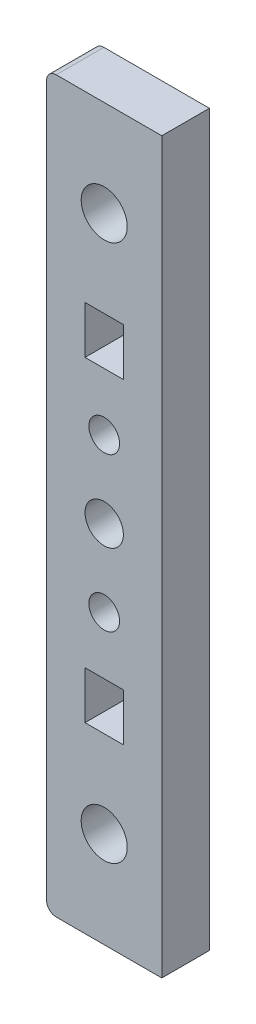
ISO-10303-21;
HEADER;
FILE_DESCRIPTION(('STEP AP214'),'2;1');
FILE_NAME('part.step','',(''),(''),'','','');
FILE_SCHEMA(('AUTOMOTIVE_DESIGN { 1 0 10303 214 1 1 1 1 }'));
ENDSEC;
DATA;
#1=APPLICATION_CONTEXT('core data for automotive mechanical design processes');
#2=APPLICATION_PROTOCOL_DEFINITION('international standard','automotive_design',2000,#1);
#3=PRODUCT_CONTEXT('',#1,'mechanical');
#4=PRODUCT('Part','Part','',(#3));
#5=PRODUCT_RELATED_PRODUCT_CATEGORY('part','',(#4));
#6=PRODUCT_DEFINITION_FORMATION('','',#4);
#7=PRODUCT_DEFINITION_CONTEXT('part definition',#1,'design');
#8=PRODUCT_DEFINITION('design','',#6,#7);
#9=PRODUCT_DEFINITION_SHAPE('','',#8);
#10=(LENGTH_UNIT() NAMED_UNIT(*) SI_UNIT(.MILLI.,.METRE.));
#11=(NAMED_UNIT(*) PLANE_ANGLE_UNIT() SI_UNIT($,.RADIAN.));
#12=(NAMED_UNIT(*) SI_UNIT($,.STERADIAN.) SOLID_ANGLE_UNIT());
#13=UNCERTAINTY_MEASURE_WITH_UNIT(LENGTH_MEASURE(1.E-05),#10,'distance_accuracy_value','');
#14=(GEOMETRIC_REPRESENTATION_CONTEXT(3) GLOBAL_UNCERTAINTY_ASSIGNED_CONTEXT((#13)) GLOBAL_UNIT_ASSIGNED_CONTEXT((#10,
#11,#12)) REPRESENTATION_CONTEXT('',''));
#15=CARTESIAN_POINT('',(0.,0.,0.));
#16=DIRECTION('',(0.,0.,1.));
#17=DIRECTION('',(1.,0.,0.));
#18=AXIS2_PLACEMENT_3D('',#15,#16,#17);
#19=CARTESIAN_POINT('',(-27.5,187.5,12.4));
#20=DIRECTION('',(0.,0.,1.));
#21=DIRECTION('',(1.,0.,0.));
#22=AXIS2_PLACEMENT_3D('',#19,#20,#21);
#23=PLANE('',#22);
#24=CARTESIAN_POINT('',(-15.,115.,12.4));
#25=DIRECTION('',(0.,0.,1.));
#26=DIRECTION('',(1.,0.,0.));
#27=AXIS2_PLACEMENT_3D('',#24,#25,#26);
#28=CIRCLE('',#27,4.00000000000001);
#29=CARTESIAN_POINT('',(-19.,115.,12.4));
#30=VERTEX_POINT('',#29);
#31=EDGE_CURVE('E163',#30,#30,#28,.T.);
#32=ORIENTED_EDGE('',*,*,#31,.F.);
#33=EDGE_LOOP('',(#32));
#34=FACE_BOUND('',#33,.T.);
#35=DIRECTION('',(-1.,0.,0.));
#36=VECTOR('',#35,1.);
#37=CARTESIAN_POINT('',(-20.,142.4,12.4));
#38=LINE('',#37,#36);
#39=CARTESIAN_POINT('',(-10.,142.4,12.4));
#40=VERTEX_POINT('',#39);
#41=CARTESIAN_POINT('',(-20.,142.4,12.4));
#42=VERTEX_POINT('',#41);
#43=EDGE_CURVE('E181',#40,#42,#38,.T.);
#44=ORIENTED_EDGE('',*,*,#43,.F.);
#45=DIRECTION('',(0.,1.,0.));
#46=VECTOR('',#45,1.);
#47=CARTESIAN_POINT('',(-10.,142.4,12.4));
#48=LINE('',#47,#46);
#49=CARTESIAN_POINT('',(-10.,130.,12.4));
#50=VERTEX_POINT('',#49);
#51=EDGE_CURVE('E179',#50,#40,#48,.T.);
#52=ORIENTED_EDGE('',*,*,#51,.F.);
#53=DIRECTION('',(1.,0.,0.));
#54=VECTOR('',#53,1.);
#55=CARTESIAN_POINT('',(-20.,130.,12.4));
#56=LINE('',#55,#54);
#57=CARTESIAN_POINT('',(-20.,130.,12.4));
#58=VERTEX_POINT('',#57);
#59=EDGE_CURVE('E187',#58,#50,#56,.T.);
#60=ORIENTED_EDGE('',*,*,#59,.F.);
#61=DIRECTION('',(0.,-1.,0.));
#62=VECTOR('',#61,1.);
#63=CARTESIAN_POINT('',(-20.,142.4,12.4));
#64=LINE('',#63,#62);
#65=EDGE_CURVE('E184',#42,#58,#64,.T.);
#66=ORIENTED_EDGE('',*,*,#65,.F.);
#67=EDGE_LOOP('',(#44,#52,#60,#66));
#68=FACE_BOUND('',#67,.T.);
#69=CARTESIAN_POINT('',(-15.,95.,12.4));
#70=DIRECTION('',(0.,0.,1.));
#71=DIRECTION('',(1.,0.,0.));
#72=AXIS2_PLACEMENT_3D('',#69,#70,#71);
#73=CIRCLE('',#72,5.);
#74=CARTESIAN_POINT('',(-20.,95.,12.4));
#75=VERTEX_POINT('',#74);
#76=EDGE_CURVE('E210',#75,#75,#73,.T.);
#77=ORIENTED_EDGE('',*,*,#76,.F.);
#78=EDGE_LOOP('',(#77));
#79=FACE_BOUND('',#78,.T.);
#80=DIRECTION('',(0.,1.,0.));
#81=VECTOR('',#80,1.);
#82=CARTESIAN_POINT('',(0.,0.,12.4));
#83=LINE('',#82,#81);
#84=CARTESIAN_POINT('',(0.,0.,12.4));
#85=VERTEX_POINT('',#84);
#86=CARTESIAN_POINT('',(0.,190.,12.4));
#87=VERTEX_POINT('',#86);
#88=EDGE_CURVE('E222',#85,#87,#83,.T.);
#89=ORIENTED_EDGE('',*,*,#88,.T.);
#90=DIRECTION('',(-1.,0.,0.));
#91=VECTOR('',#90,1.);
#92=CARTESIAN_POINT('',(-27.5,190.,12.4));
#93=LINE('',#92,#91);
#94=CARTESIAN_POINT('',(-27.5,190.,12.4));
#95=VERTEX_POINT('',#94);
#96=EDGE_CURVE('E225',#87,#95,#93,.T.);
#97=ORIENTED_EDGE('',*,*,#96,.T.);
#98=CARTESIAN_POINT('',(-27.5,187.5,12.4));
#99=DIRECTION('',(0.,0.,1.));
#100=DIRECTION('',(1.,0.,0.));
#101=AXIS2_PLACEMENT_3D('',#98,#99,#100);
#102=CIRCLE('',#101,2.5);
#103=CARTESIAN_POINT('',(-30.,187.5,12.4));
#104=VERTEX_POINT('',#103);
#105=EDGE_CURVE('E228',#95,#104,#102,.T.);
#106=ORIENTED_EDGE('',*,*,#105,.T.);
#107=DIRECTION('',(0.,-1.,0.));
#108=VECTOR('',#107,1.);
#109=CARTESIAN_POINT('',(-30.,2.5,12.4));
#110=LINE('',#109,#108);
#111=CARTESIAN_POINT('',(-30.,2.5,12.4));
#112=VERTEX_POINT('',#111);
#113=EDGE_CURVE('E230',#104,#112,#110,.T.);
#114=ORIENTED_EDGE('',*,*,#113,.T.);
#115=CARTESIAN_POINT('',(-27.5,2.5,12.4));
#116=DIRECTION('',(0.,0.,1.));
#117=DIRECTION('',(1.,0.,0.));
#118=AXIS2_PLACEMENT_3D('',#115,#116,#117);
#119=CIRCLE('',#118,2.5);
#120=CARTESIAN_POINT('',(-27.5,0.,12.4));
#121=VERTEX_POINT('',#120);
#122=EDGE_CURVE('E232',#112,#121,#119,.T.);
#123=ORIENTED_EDGE('',*,*,#122,.T.);
#124=DIRECTION('',(1.,0.,0.));
#125=VECTOR('',#124,1.);
#126=CARTESIAN_POINT('',(-27.5,0.,12.4));
#127=LINE('',#126,#125);
#128=EDGE_CURVE('E234',#121,#85,#127,.T.);
#129=ORIENTED_EDGE('',*,*,#128,.T.);
#130=EDGE_LOOP('',(#89,#97,#106,#114,#123,#129));
#131=FACE_BOUND('',#130,.T.);
#132=CARTESIAN_POINT('',(-15.,165.,12.4));
#133=DIRECTION('',(0.,0.,1.));
#134=DIRECTION('',(1.,0.,0.));
#135=AXIS2_PLACEMENT_3D('',#132,#133,#134);
#136=CIRCLE('',#135,6.);
#137=CARTESIAN_POINT('',(-21.,165.,12.4));
#138=VERTEX_POINT('',#137);
#139=EDGE_CURVE('E216',#138,#138,#136,.T.);
#140=ORIENTED_EDGE('',*,*,#139,.F.);
#141=EDGE_LOOP('',(#140));
#142=FACE_BOUND('',#141,.T.);
#143=CARTESIAN_POINT('',(-15.,25.,12.4));
#144=DIRECTION('',(0.,0.,1.));
#145=DIRECTION('',(-1.,0.,0.));
#146=AXIS2_PLACEMENT_3D('',#143,#144,#145);
#147=CIRCLE('',#146,6.);
#148=CARTESIAN_POINT('',(-21.,25.,12.4));
#149=VERTEX_POINT('',#148);
#150=EDGE_CURVE('E173',#149,#149,#147,.T.);
#151=ORIENTED_EDGE('',*,*,#150,.F.);
#152=EDGE_LOOP('',(#151));
#153=FACE_BOUND('',#152,.T.);
#154=DIRECTION('',(1.,0.,0.));
#155=VECTOR('',#154,1.);
#156=CARTESIAN_POINT('',(-20.,47.6,12.4));
#157=LINE('',#156,#155);
#158=CARTESIAN_POINT('',(-20.,47.6,12.4));
#159=VERTEX_POINT('',#158);
#160=CARTESIAN_POINT('',(-10.,47.6,12.4));
#161=VERTEX_POINT('',#160);
#162=EDGE_CURVE('E142',#159,#161,#157,.T.);
#163=ORIENTED_EDGE('',*,*,#162,.F.);
#164=DIRECTION('',(0.,-1.,0.));
#165=VECTOR('',#164,1.);
#166=CARTESIAN_POINT('',(-20.,47.6,12.4));
#167=LINE('',#166,#165);
#168=CARTESIAN_POINT('',(-20.,60.,12.4));
#169=VERTEX_POINT('',#168);
#170=EDGE_CURVE('E134',#169,#159,#167,.T.);
#171=ORIENTED_EDGE('',*,*,#170,.F.);
#172=DIRECTION('',(-1.,0.,0.));
#173=VECTOR('',#172,1.);
#174=CARTESIAN_POINT('',(-20.,60.,12.4));
#175=LINE('',#174,#173);
#176=CARTESIAN_POINT('',(-10.,60.,12.4));
#177=VERTEX_POINT('',#176);
#178=EDGE_CURVE('E157',#177,#169,#175,.T.);
#179=ORIENTED_EDGE('',*,*,#178,.F.);
#180=DIRECTION('',(0.,1.,0.));
#181=VECTOR('',#180,1.);
#182=CARTESIAN_POINT('',(-10.,47.6,12.4));
#183=LINE('',#182,#181);
#184=EDGE_CURVE('E155',#161,#177,#183,.T.);
#185=ORIENTED_EDGE('',*,*,#184,.F.);
#186=EDGE_LOOP('',(#163,#171,#179,#185));
#187=FACE_BOUND('',#186,.T.);
#188=CARTESIAN_POINT('',(-15.,75.,12.4));
#189=DIRECTION('',(0.,0.,1.));
#190=DIRECTION('',(-1.,0.,0.));
#191=AXIS2_PLACEMENT_3D('',#188,#189,#190);
#192=CIRCLE('',#191,4.00000000000001);
#193=CARTESIAN_POINT('',(-19.,75.,12.4));
#194=VERTEX_POINT('',#193);
#195=EDGE_CURVE('E359',#194,#194,#192,.T.);
#196=ORIENTED_EDGE('',*,*,#195,.F.);
#197=EDGE_LOOP('',(#196));
#198=FACE_BOUND('',#197,.T.);
#199=ADVANCED_FACE('F33',(#34,#68,#79,#131,#142,#153,#187,#198),#23,.T.);
#200=CARTESIAN_POINT('',(-27.5,187.5,0.));
#201=DIRECTION('',(0.,0.,1.));
#202=DIRECTION('',(1.,0.,0.));
#203=AXIS2_PLACEMENT_3D('',#200,#201,#202);
#204=PLANE('',#203);
#205=CARTESIAN_POINT('',(-15.,25.,0.));
#206=DIRECTION('',(0.,0.,1.));
#207=DIRECTION('',(-1.,0.,0.));
#208=AXIS2_PLACEMENT_3D('',#205,#206,#207);
#209=CIRCLE('',#208,6.);
#210=CARTESIAN_POINT('',(-21.,25.,0.));
#211=VERTEX_POINT('',#210);
#212=EDGE_CURVE('E150',#211,#211,#209,.T.);
#213=ORIENTED_EDGE('',*,*,#212,.T.);
#214=EDGE_LOOP('',(#213));
#215=FACE_BOUND('',#214,.T.);
#216=DIRECTION('',(0.,1.,0.));
#217=VECTOR('',#216,1.);
#218=CARTESIAN_POINT('',(-10.,142.4,0.));
#219=LINE('',#218,#217);
#220=CARTESIAN_POINT('',(-10.,130.,0.));
#221=VERTEX_POINT('',#220);
#222=CARTESIAN_POINT('',(-10.,142.4,0.));
#223=VERTEX_POINT('',#222);
#224=EDGE_CURVE('E176',#221,#223,#219,.T.);
#225=ORIENTED_EDGE('',*,*,#224,.T.);
#226=DIRECTION('',(-1.,0.,0.));
#227=VECTOR('',#226,1.);
#228=CARTESIAN_POINT('',(-20.,142.4,0.));
#229=LINE('',#228,#227);
#230=CARTESIAN_POINT('',(-20.,142.4,0.));
#231=VERTEX_POINT('',#230);
#232=EDGE_CURVE('E192',#223,#231,#229,.T.);
#233=ORIENTED_EDGE('',*,*,#232,.T.);
#234=DIRECTION('',(0.,-1.,0.));
#235=VECTOR('',#234,1.);
#236=CARTESIAN_POINT('',(-20.,142.4,0.));
#237=LINE('',#236,#235);
#238=CARTESIAN_POINT('',(-20.,130.,0.));
#239=VERTEX_POINT('',#238);
#240=EDGE_CURVE('E195',#231,#239,#237,.T.);
#241=ORIENTED_EDGE('',*,*,#240,.T.);
#242=DIRECTION('',(1.,0.,0.));
#243=VECTOR('',#242,1.);
#244=CARTESIAN_POINT('',(-20.,130.,0.));
#245=LINE('',#244,#243);
#246=EDGE_CURVE('E182',#239,#221,#245,.T.);
#247=ORIENTED_EDGE('',*,*,#246,.T.);
#248=EDGE_LOOP('',(#225,#233,#241,#247));
#249=FACE_BOUND('',#248,.T.);
#250=DIRECTION('',(0.,1.,0.));
#251=VECTOR('',#250,1.);
#252=CARTESIAN_POINT('',(0.,0.,0.));
#253=LINE('',#252,#251);
#254=CARTESIAN_POINT('',(0.,0.,0.));
#255=VERTEX_POINT('',#254);
#256=CARTESIAN_POINT('',(0.,190.,0.));
#257=VERTEX_POINT('',#256);
#258=EDGE_CURVE('E219',#255,#257,#253,.T.);
#259=ORIENTED_EDGE('',*,*,#258,.F.);
#260=DIRECTION('',(1.,0.,0.));
#261=VECTOR('',#260,1.);
#262=CARTESIAN_POINT('',(-27.5,0.,0.));
#263=LINE('',#262,#261);
#264=CARTESIAN_POINT('',(-27.5,0.,0.));
#265=VERTEX_POINT('',#264);
#266=EDGE_CURVE('E226',#265,#255,#263,.T.);
#267=ORIENTED_EDGE('',*,*,#266,.F.);
#268=CARTESIAN_POINT('',(-27.5,2.5,0.));
#269=DIRECTION('',(0.,0.,1.));
#270=DIRECTION('',(1.,0.,0.));
#271=AXIS2_PLACEMENT_3D('',#268,#269,#270);
#272=CIRCLE('',#271,2.5);
#273=CARTESIAN_POINT('',(-30.,2.5,0.));
#274=VERTEX_POINT('',#273);
#275=EDGE_CURVE('E245',#274,#265,#272,.T.);
#276=ORIENTED_EDGE('',*,*,#275,.F.);
#277=DIRECTION('',(0.,-1.,0.));
#278=VECTOR('',#277,1.);
#279=CARTESIAN_POINT('',(-30.,2.5,0.));
#280=LINE('',#279,#278);
#281=CARTESIAN_POINT('',(-30.,187.5,0.));
#282=VERTEX_POINT('',#281);
#283=EDGE_CURVE('E243',#282,#274,#280,.T.);
#284=ORIENTED_EDGE('',*,*,#283,.F.);
#285=CARTESIAN_POINT('',(-27.5,187.5,0.));
#286=DIRECTION('',(0.,0.,1.));
#287=DIRECTION('',(1.,0.,0.));
#288=AXIS2_PLACEMENT_3D('',#285,#286,#287);
#289=CIRCLE('',#288,2.5);
#290=CARTESIAN_POINT('',(-27.5,190.,0.));
#291=VERTEX_POINT('',#290);
#292=EDGE_CURVE('E241',#291,#282,#289,.T.);
#293=ORIENTED_EDGE('',*,*,#292,.F.);
#294=DIRECTION('',(-1.,0.,0.));
#295=VECTOR('',#294,1.);
#296=CARTESIAN_POINT('',(-27.5,190.,0.));
#297=LINE('',#296,#295);
#298=EDGE_CURVE('E239',#257,#291,#297,.T.);
#299=ORIENTED_EDGE('',*,*,#298,.F.);
#300=EDGE_LOOP('',(#259,#267,#276,#284,#293,#299));
#301=FACE_BOUND('',#300,.T.);
#302=CARTESIAN_POINT('',(-15.,165.,0.));
#303=DIRECTION('',(0.,0.,1.));
#304=DIRECTION('',(1.,0.,0.));
#305=AXIS2_PLACEMENT_3D('',#302,#303,#304);
#306=CIRCLE('',#305,6.);
#307=CARTESIAN_POINT('',(-21.,165.,0.));
#308=VERTEX_POINT('',#307);
#309=EDGE_CURVE('E213',#308,#308,#306,.T.);
#310=ORIENTED_EDGE('',*,*,#309,.T.);
#311=EDGE_LOOP('',(#310));
#312=FACE_BOUND('',#311,.T.);
#313=CARTESIAN_POINT('',(-15.,95.,0.));
#314=DIRECTION('',(0.,0.,1.));
#315=DIRECTION('',(1.,0.,0.));
#316=AXIS2_PLACEMENT_3D('',#313,#314,#315);
#317=CIRCLE('',#316,5.);
#318=CARTESIAN_POINT('',(-20.,95.,0.));
#319=VERTEX_POINT('',#318);
#320=EDGE_CURVE('E209',#319,#319,#317,.T.);
#321=ORIENTED_EDGE('',*,*,#320,.T.);
#322=EDGE_LOOP('',(#321));
#323=FACE_BOUND('',#322,.T.);
#324=DIRECTION('',(0.,-1.,0.));
#325=VECTOR('',#324,1.);
#326=CARTESIAN_POINT('',(-20.,47.6,0.));
#327=LINE('',#326,#325);
#328=CARTESIAN_POINT('',(-20.,60.,0.));
#329=VERTEX_POINT('',#328);
#330=CARTESIAN_POINT('',(-20.,47.6,0.));
#331=VERTEX_POINT('',#330);
#332=EDGE_CURVE('E56',#329,#331,#327,.T.);
#333=ORIENTED_EDGE('',*,*,#332,.T.);
#334=DIRECTION('',(1.,0.,0.));
#335=VECTOR('',#334,1.);
#336=CARTESIAN_POINT('',(-20.,47.6,0.));
#337=LINE('',#336,#335);
#338=CARTESIAN_POINT('',(-10.,47.6,0.));
#339=VERTEX_POINT('',#338);
#340=EDGE_CURVE('E149',#331,#339,#337,.T.);
#341=ORIENTED_EDGE('',*,*,#340,.T.);
#342=DIRECTION('',(0.,1.,0.));
#343=VECTOR('',#342,1.);
#344=CARTESIAN_POINT('',(-10.,47.6,0.));
#345=LINE('',#344,#343);
#346=CARTESIAN_POINT('',(-10.,60.,0.));
#347=VERTEX_POINT('',#346);
#348=EDGE_CURVE('E165',#339,#347,#345,.T.);
#349=ORIENTED_EDGE('',*,*,#348,.T.);
#350=DIRECTION('',(-1.,0.,0.));
#351=VECTOR('',#350,1.);
#352=CARTESIAN_POINT('',(-20.,60.,0.));
#353=LINE('',#352,#351);
#354=EDGE_CURVE('E143',#347,#329,#353,.T.);
#355=ORIENTED_EDGE('',*,*,#354,.T.);
#356=EDGE_LOOP('',(#333,#341,#349,#355));
#357=FACE_BOUND('',#356,.T.);
#358=CARTESIAN_POINT('',(-15.,115.,0.));
#359=DIRECTION('',(0.,0.,1.));
#360=DIRECTION('',(1.,0.,0.));
#361=AXIS2_PLACEMENT_3D('',#358,#359,#360);
#362=CIRCLE('',#361,4.00000000000001);
#363=CARTESIAN_POINT('',(-19.,115.,0.));
#364=VERTEX_POINT('',#363);
#365=EDGE_CURVE('E365',#364,#364,#362,.T.);
#366=ORIENTED_EDGE('',*,*,#365,.T.);
#367=EDGE_LOOP('',(#366));
#368=FACE_BOUND('',#367,.T.);
#369=CARTESIAN_POINT('',(-15.,75.,0.));
#370=DIRECTION('',(0.,0.,1.));
#371=DIRECTION('',(-1.,0.,0.));
#372=AXIS2_PLACEMENT_3D('',#369,#370,#371);
#373=CIRCLE('',#372,4.00000000000001);
#374=CARTESIAN_POINT('',(-19.,75.,0.));
#375=VERTEX_POINT('',#374);
#376=EDGE_CURVE('E362',#375,#375,#373,.T.);
#377=ORIENTED_EDGE('',*,*,#376,.T.);
#378=EDGE_LOOP('',(#377));
#379=FACE_BOUND('',#378,.T.);
#380=ADVANCED_FACE('F269',(#215,#249,#301,#312,#323,#357,#368,#379),#204,.F.);
#381=CARTESIAN_POINT('',(0.,0.,12.4));
#382=DIRECTION('',(-1.,0.,0.));
#383=DIRECTION('',(0.,0.,1.));
#384=AXIS2_PLACEMENT_3D('',#381,#382,#383);
#385=PLANE('',#384);
#386=ORIENTED_EDGE('',*,*,#258,.T.);
#387=DIRECTION('',(0.,0.,-1.));
#388=VECTOR('',#387,1.);
#389=CARTESIAN_POINT('',(0.,190.,12.4));
#390=LINE('',#389,#388);
#391=EDGE_CURVE('E11',#87,#257,#390,.T.);
#392=ORIENTED_EDGE('',*,*,#391,.F.);
#393=ORIENTED_EDGE('',*,*,#88,.F.);
#394=DIRECTION('',(0.,0.,-1.));
#395=VECTOR('',#394,1.);
#396=CARTESIAN_POINT('',(0.,0.,12.4));
#397=LINE('',#396,#395);
#398=EDGE_CURVE('E236',#85,#255,#397,.T.);
#399=ORIENTED_EDGE('',*,*,#398,.T.);
#400=EDGE_LOOP('',(#386,#392,#393,#399));
#401=FACE_BOUND('',#400,.T.);
#402=ADVANCED_FACE('F35',(#401),#385,.F.);
#403=CARTESIAN_POINT('',(-27.5,190.,12.4));
#404=DIRECTION('',(0.,-1.,0.));
#405=DIRECTION('',(0.,0.,-1.));
#406=AXIS2_PLACEMENT_3D('',#403,#404,#405);
#407=PLANE('',#406);
#408=ORIENTED_EDGE('',*,*,#298,.T.);
#409=DIRECTION('',(0.,0.,-1.));
#410=VECTOR('',#409,1.);
#411=CARTESIAN_POINT('',(-27.5,190.,12.4));
#412=LINE('',#411,#410);
#413=EDGE_CURVE('E41',#95,#291,#412,.T.);
#414=ORIENTED_EDGE('',*,*,#413,.F.);
#415=ORIENTED_EDGE('',*,*,#96,.F.);
#416=ORIENTED_EDGE('',*,*,#391,.T.);
#417=EDGE_LOOP('',(#408,#414,#415,#416));
#418=FACE_BOUND('',#417,.T.);
#419=ADVANCED_FACE('F287',(#418),#407,.F.);
#420=CARTESIAN_POINT('',(-27.5,187.5,12.4));
#421=DIRECTION('',(0.,0.,-1.));
#422=DIRECTION('',(-1.,0.,0.));
#423=AXIS2_PLACEMENT_3D('',#420,#421,#422);
#424=CYLINDRICAL_SURFACE('',#423,2.5);
#425=ORIENTED_EDGE('',*,*,#292,.T.);
#426=DIRECTION('',(0.,0.,-1.));
#427=VECTOR('',#426,1.);
#428=CARTESIAN_POINT('',(-30.,187.5,12.4));
#429=LINE('',#428,#427);
#430=EDGE_CURVE('E256',#104,#282,#429,.T.);
#431=ORIENTED_EDGE('',*,*,#430,.F.);
#432=ORIENTED_EDGE('',*,*,#105,.F.);
#433=ORIENTED_EDGE('',*,*,#413,.T.);
#434=EDGE_LOOP('',(#425,#431,#432,#433));
#435=FACE_BOUND('',#434,.T.);
#436=ADVANCED_FACE('F263',(#435),#424,.T.);
#437=CARTESIAN_POINT('',(-30.,2.5,12.4));
#438=DIRECTION('',(1.,0.,0.));
#439=DIRECTION('',(0.,0.,-1.));
#440=AXIS2_PLACEMENT_3D('',#437,#438,#439);
#441=PLANE('',#440);
#442=ORIENTED_EDGE('',*,*,#283,.T.);
#443=DIRECTION('',(0.,0.,-1.));
#444=VECTOR('',#443,1.);
#445=CARTESIAN_POINT('',(-30.,2.5,12.4));
#446=LINE('',#445,#444);
#447=EDGE_CURVE('E253',#112,#274,#446,.T.);
#448=ORIENTED_EDGE('',*,*,#447,.F.);
#449=ORIENTED_EDGE('',*,*,#113,.F.);
#450=ORIENTED_EDGE('',*,*,#430,.T.);
#451=EDGE_LOOP('',(#442,#448,#449,#450));
#452=FACE_BOUND('',#451,.T.);
#453=ADVANCED_FACE('F275',(#452),#441,.F.);
#454=CARTESIAN_POINT('',(-27.5,2.5,12.4));
#455=DIRECTION('',(0.,0.,-1.));
#456=DIRECTION('',(-1.,0.,0.));
#457=AXIS2_PLACEMENT_3D('',#454,#455,#456);
#458=CYLINDRICAL_SURFACE('',#457,2.5);
#459=ORIENTED_EDGE('',*,*,#275,.T.);
#460=DIRECTION('',(0.,0.,-1.));
#461=VECTOR('',#460,1.);
#462=CARTESIAN_POINT('',(-27.5,0.,12.4));
#463=LINE('',#462,#461);
#464=EDGE_CURVE('E250',#121,#265,#463,.T.);
#465=ORIENTED_EDGE('',*,*,#464,.F.);
#466=ORIENTED_EDGE('',*,*,#122,.F.);
#467=ORIENTED_EDGE('',*,*,#447,.T.);
#468=EDGE_LOOP('',(#459,#465,#466,#467));
#469=FACE_BOUND('',#468,.T.);
#470=ADVANCED_FACE('F279',(#469),#458,.T.);
#471=CARTESIAN_POINT('',(-27.5,0.,12.4));
#472=DIRECTION('',(0.,1.,0.));
#473=DIRECTION('',(0.,0.,1.));
#474=AXIS2_PLACEMENT_3D('',#471,#472,#473);
#475=PLANE('',#474);
#476=ORIENTED_EDGE('',*,*,#266,.T.);
#477=ORIENTED_EDGE('',*,*,#398,.F.);
#478=ORIENTED_EDGE('',*,*,#128,.F.);
#479=ORIENTED_EDGE('',*,*,#464,.T.);
#480=EDGE_LOOP('',(#476,#477,#478,#479));
#481=FACE_BOUND('',#480,.T.);
#482=ADVANCED_FACE('F290',(#481),#475,.F.);
#483=CARTESIAN_POINT('',(-15.,165.,12.4));
#484=DIRECTION('',(0.,0.,-1.));
#485=DIRECTION('',(-1.,0.,0.));
#486=AXIS2_PLACEMENT_3D('',#483,#484,#485);
#487=CYLINDRICAL_SURFACE('',#486,6.);
#488=CARTESIAN_POINT('',(-21.,165.,12.4));
#489=CARTESIAN_POINT('',(-21.,165.,12.2708333333333));
#490=CARTESIAN_POINT('',(-21.,165.,12.1416666666667));
#491=CARTESIAN_POINT('',(-21.,165.,11.8833333333333));
#492=CARTESIAN_POINT('',(-21.,165.,11.7541666666667));
#493=CARTESIAN_POINT('',(-21.,165.,11.4958333333333));
#494=CARTESIAN_POINT('',(-21.,165.,11.3666666666667));
#495=CARTESIAN_POINT('',(-21.,165.,11.1083333333333));
#496=CARTESIAN_POINT('',(-21.,165.,10.9791666666667));
#497=CARTESIAN_POINT('',(-21.,165.,10.7208333333333));
#498=CARTESIAN_POINT('',(-21.,165.,10.5916666666667));
#499=CARTESIAN_POINT('',(-21.,165.,10.3333333333333));
#500=CARTESIAN_POINT('',(-21.,165.,10.2041666666667));
#501=CARTESIAN_POINT('',(-21.,165.,9.94583333333333));
#502=CARTESIAN_POINT('',(-21.,165.,9.81666666666666));
#503=CARTESIAN_POINT('',(-21.,165.,9.55833333333333));
#504=CARTESIAN_POINT('',(-21.,165.,9.42916666666667));
#505=CARTESIAN_POINT('',(-21.,165.,9.17083333333333));
#506=CARTESIAN_POINT('',(-21.,165.,9.04166666666667));
#507=CARTESIAN_POINT('',(-21.,165.,8.78333333333333));
#508=CARTESIAN_POINT('',(-21.,165.,8.65416666666667));
#509=CARTESIAN_POINT('',(-21.,165.,8.39583333333333));
#510=CARTESIAN_POINT('',(-21.,165.,8.26666666666667));
#511=CARTESIAN_POINT('',(-21.,165.,8.00833333333333));
#512=CARTESIAN_POINT('',(-21.,165.,7.87916666666667));
#513=CARTESIAN_POINT('',(-21.,165.,7.62083333333333));
#514=CARTESIAN_POINT('',(-21.,165.,7.49166666666667));
#515=CARTESIAN_POINT('',(-21.,165.,7.23333333333333));
#516=CARTESIAN_POINT('',(-21.,165.,7.10416666666667));
#517=CARTESIAN_POINT('',(-21.,165.,6.84583333333333));
#518=CARTESIAN_POINT('',(-21.,165.,6.71666666666667));
#519=CARTESIAN_POINT('',(-21.,165.,6.45833333333333));
#520=CARTESIAN_POINT('',(-21.,165.,6.32916666666667));
#521=CARTESIAN_POINT('',(-21.,165.,6.07083333333333));
#522=CARTESIAN_POINT('',(-21.,165.,5.94166666666667));
#523=CARTESIAN_POINT('',(-21.,165.,5.68333333333333));
#524=CARTESIAN_POINT('',(-21.,165.,5.55416666666667));
#525=CARTESIAN_POINT('',(-21.,165.,5.29583333333333));
#526=CARTESIAN_POINT('',(-21.,165.,5.16666666666667));
#527=CARTESIAN_POINT('',(-21.,165.,4.90833333333333));
#528=CARTESIAN_POINT('',(-21.,165.,4.77916666666667));
#529=CARTESIAN_POINT('',(-21.,165.,4.52083333333333));
#530=CARTESIAN_POINT('',(-21.,165.,4.39166666666667));
#531=CARTESIAN_POINT('',(-21.,165.,4.13333333333333));
#532=CARTESIAN_POINT('',(-21.,165.,4.00416666666667));
#533=CARTESIAN_POINT('',(-21.,165.,3.74583333333333));
#534=CARTESIAN_POINT('',(-21.,165.,3.61666666666667));
#535=CARTESIAN_POINT('',(-21.,165.,3.35833333333333));
#536=CARTESIAN_POINT('',(-21.,165.,3.22916666666667));
#537=CARTESIAN_POINT('',(-21.,165.,2.97083333333333));
#538=CARTESIAN_POINT('',(-21.,165.,2.84166666666667));
#539=CARTESIAN_POINT('',(-21.,165.,2.58333333333333));
#540=CARTESIAN_POINT('',(-21.,165.,2.45416666666667));
#541=CARTESIAN_POINT('',(-21.,165.,2.19583333333333));
#542=CARTESIAN_POINT('',(-21.,165.,2.06666666666667));
#543=CARTESIAN_POINT('',(-21.,165.,1.80833333333333));
#544=CARTESIAN_POINT('',(-21.,165.,1.67916666666667));
#545=CARTESIAN_POINT('',(-21.,165.,1.42083333333333));
#546=CARTESIAN_POINT('',(-21.,165.,1.29166666666667));
#547=CARTESIAN_POINT('',(-21.,165.,1.03333333333333));
#548=CARTESIAN_POINT('',(-21.,165.,0.904166666666667));
#549=CARTESIAN_POINT('',(-21.,165.,0.645833333333333));
#550=CARTESIAN_POINT('',(-21.,165.,0.516666666666667));
#551=CARTESIAN_POINT('',(-21.,165.,0.258333333333334));
#552=CARTESIAN_POINT('',(-21.,165.,0.129166666666667));
#553=CARTESIAN_POINT('',(-21.,165.,0.));
#554=B_SPLINE_CURVE_WITH_KNOTS('',3,(#488,#489,#490,#491,#492,#493,#494,#495,#496,#497,#498,
#499,#500,#501,#502,#503,#504,#505,#506,#507,#508,#509,#510,#511,#512,#513,#514,#515,#516,#517,
#518,#519,#520,#521,#522,#523,#524,#525,#526,#527,#528,#529,#530,#531,#532,#533,#534,#535,#536,
#537,#538,#539,#540,#541,#542,#543,#544,#545,#546,#547,#548,#549,#550,#551,#552,#553),
.UNSPECIFIED.,.F.,.F.,(4,2,2,2,2,2,2,2,2,2,2,2,2,2,2,2,2,2,2,2,2,2,2,2,2,2,2,2,2,2,2,2,4),(0.,
0.387499999999999,0.775,1.1625,1.55,1.9375,2.325,2.7125,3.1,3.4875,3.875,4.2625,4.65,5.0375,
5.425,5.8125,6.2,6.5875,6.975,7.3625,7.75,8.1375,8.525,8.9125,9.3,9.6875,10.075,10.4625,10.85,
11.2375,11.625,12.0125,12.4),.UNSPECIFIED.);
#555=EDGE_CURVE('BSEAM292',#138,#308,#554,.T.);
#556=ORIENTED_EDGE('',*,*,#139,.T.);
#557=ORIENTED_EDGE('',*,*,#309,.F.);
#558=ORIENTED_EDGE('',*,*,#555,.T.);
#559=ORIENTED_EDGE('',*,*,#555,.F.);
#560=EDGE_LOOP('',(#556,#558,#557,#559));
#561=FACE_BOUND('',#560,.T.);
#562=ADVANCED_FACE('F292',(#561),#487,.F.);
#563=CARTESIAN_POINT('',(-15.,95.,12.4));
#564=DIRECTION('',(0.,0.,-1.));
#565=DIRECTION('',(-1.,0.,0.));
#566=AXIS2_PLACEMENT_3D('',#563,#564,#565);
#567=CYLINDRICAL_SURFACE('',#566,5.);
#568=CARTESIAN_POINT('',(-20.,95.,12.4));
#569=CARTESIAN_POINT('',(-20.,95.,12.2708333333333));
#570=CARTESIAN_POINT('',(-20.,95.,12.1416666666667));
#571=CARTESIAN_POINT('',(-20.,95.,11.8833333333333));
#572=CARTESIAN_POINT('',(-20.,95.,11.7541666666667));
#573=CARTESIAN_POINT('',(-20.,95.,11.4958333333333));
#574=CARTESIAN_POINT('',(-20.,95.,11.3666666666667));
#575=CARTESIAN_POINT('',(-20.,95.,11.1083333333333));
#576=CARTESIAN_POINT('',(-20.,95.,10.9791666666667));
#577=CARTESIAN_POINT('',(-20.,95.,10.7208333333333));
#578=CARTESIAN_POINT('',(-20.,95.,10.5916666666667));
#579=CARTESIAN_POINT('',(-20.,95.,10.3333333333333));
#580=CARTESIAN_POINT('',(-20.,95.,10.2041666666667));
#581=CARTESIAN_POINT('',(-20.,95.,9.94583333333333));
#582=CARTESIAN_POINT('',(-20.,95.,9.81666666666666));
#583=CARTESIAN_POINT('',(-20.,95.,9.55833333333333));
#584=CARTESIAN_POINT('',(-20.,95.,9.42916666666667));
#585=CARTESIAN_POINT('',(-20.,95.,9.17083333333333));
#586=CARTESIAN_POINT('',(-20.,95.,9.04166666666667));
#587=CARTESIAN_POINT('',(-20.,95.,8.78333333333333));
#588=CARTESIAN_POINT('',(-20.,95.,8.65416666666667));
#589=CARTESIAN_POINT('',(-20.,95.,8.39583333333333));
#590=CARTESIAN_POINT('',(-20.,95.,8.26666666666667));
#591=CARTESIAN_POINT('',(-20.,95.,8.00833333333333));
#592=CARTESIAN_POINT('',(-20.,95.,7.87916666666667));
#593=CARTESIAN_POINT('',(-20.,95.,7.62083333333333));
#594=CARTESIAN_POINT('',(-20.,95.,7.49166666666667));
#595=CARTESIAN_POINT('',(-20.,95.,7.23333333333333));
#596=CARTESIAN_POINT('',(-20.,95.,7.10416666666667));
#597=CARTESIAN_POINT('',(-20.,95.,6.84583333333333));
#598=CARTESIAN_POINT('',(-20.,95.,6.71666666666667));
#599=CARTESIAN_POINT('',(-20.,95.,6.45833333333333));
#600=CARTESIAN_POINT('',(-20.,95.,6.32916666666667));
#601=CARTESIAN_POINT('',(-20.,95.,6.07083333333333));
#602=CARTESIAN_POINT('',(-20.,95.,5.94166666666667));
#603=CARTESIAN_POINT('',(-20.,95.,5.68333333333333));
#604=CARTESIAN_POINT('',(-20.,95.,5.55416666666667));
#605=CARTESIAN_POINT('',(-20.,95.,5.29583333333333));
#606=CARTESIAN_POINT('',(-20.,95.,5.16666666666667));
#607=CARTESIAN_POINT('',(-20.,95.,4.90833333333333));
#608=CARTESIAN_POINT('',(-20.,95.,4.77916666666667));
#609=CARTESIAN_POINT('',(-20.,95.,4.52083333333333));
#610=CARTESIAN_POINT('',(-20.,95.,4.39166666666667));
#611=CARTESIAN_POINT('',(-20.,95.,4.13333333333333));
#612=CARTESIAN_POINT('',(-20.,95.,4.00416666666667));
#613=CARTESIAN_POINT('',(-20.,95.,3.74583333333333));
#614=CARTESIAN_POINT('',(-20.,95.,3.61666666666667));
#615=CARTESIAN_POINT('',(-20.,95.,3.35833333333333));
#616=CARTESIAN_POINT('',(-20.,95.,3.22916666666667));
#617=CARTESIAN_POINT('',(-20.,95.,2.97083333333333));
#618=CARTESIAN_POINT('',(-20.,95.,2.84166666666667));
#619=CARTESIAN_POINT('',(-20.,95.,2.58333333333333));
#620=CARTESIAN_POINT('',(-20.,95.,2.45416666666667));
#621=CARTESIAN_POINT('',(-20.,95.,2.19583333333333));
#622=CARTESIAN_POINT('',(-20.,95.,2.06666666666667));
#623=CARTESIAN_POINT('',(-20.,95.,1.80833333333333));
#624=CARTESIAN_POINT('',(-20.,95.,1.67916666666667));
#625=CARTESIAN_POINT('',(-20.,95.,1.42083333333333));
#626=CARTESIAN_POINT('',(-20.,95.,1.29166666666667));
#627=CARTESIAN_POINT('',(-20.,95.,1.03333333333333));
#628=CARTESIAN_POINT('',(-20.,95.,0.904166666666667));
#629=CARTESIAN_POINT('',(-20.,95.,0.645833333333333));
#630=CARTESIAN_POINT('',(-20.,95.,0.516666666666667));
#631=CARTESIAN_POINT('',(-20.,95.,0.258333333333334));
#632=CARTESIAN_POINT('',(-20.,95.,0.129166666666667));
#633=CARTESIAN_POINT('',(-20.,95.,0.));
#634=B_SPLINE_CURVE_WITH_KNOTS('',3,(#568,#569,#570,#571,#572,#573,#574,#575,#576,#577,#578,
#579,#580,#581,#582,#583,#584,#585,#586,#587,#588,#589,#590,#591,#592,#593,#594,#595,#596,#597,
#598,#599,#600,#601,#602,#603,#604,#605,#606,#607,#608,#609,#610,#611,#612,#613,#614,#615,#616,
#617,#618,#619,#620,#621,#622,#623,#624,#625,#626,#627,#628,#629,#630,#631,#632,#633),
.UNSPECIFIED.,.F.,.F.,(4,2,2,2,2,2,2,2,2,2,2,2,2,2,2,2,2,2,2,2,2,2,2,2,2,2,2,2,2,2,2,2,4),(0.,
0.387499999999999,0.775,1.1625,1.55,1.9375,2.325,2.7125,3.1,3.4875,3.875,4.2625,4.65,5.0375,
5.425,5.8125,6.2,6.5875,6.975,7.3625,7.75,8.1375,8.525,8.9125,9.3,9.6875,10.075,10.4625,10.85,
11.2375,11.625,12.0125,12.4),.UNSPECIFIED.);
#635=EDGE_CURVE('BSEAM298',#75,#319,#634,.T.);
#636=ORIENTED_EDGE('',*,*,#76,.T.);
#637=ORIENTED_EDGE('',*,*,#320,.F.);
#638=ORIENTED_EDGE('',*,*,#635,.T.);
#639=ORIENTED_EDGE('',*,*,#635,.F.);
#640=EDGE_LOOP('',(#636,#638,#637,#639));
#641=FACE_BOUND('',#640,.T.);
#642=ADVANCED_FACE('F298',(#641),#567,.F.);
#643=CARTESIAN_POINT('',(-10.,142.4,12.4));
#644=DIRECTION('',(-1.,0.,0.));
#645=DIRECTION('',(0.,-1.,0.));
#646=AXIS2_PLACEMENT_3D('',#643,#644,#645);
#647=PLANE('',#646);
#648=ORIENTED_EDGE('',*,*,#224,.F.);
#649=DIRECTION('',(0.,0.,-1.));
#650=VECTOR('',#649,1.);
#651=CARTESIAN_POINT('',(-10.,130.,12.4));
#652=LINE('',#651,#650);
#653=EDGE_CURVE('E189',#50,#221,#652,.T.);
#654=ORIENTED_EDGE('',*,*,#653,.F.);
#655=ORIENTED_EDGE('',*,*,#51,.T.);
#656=DIRECTION('',(0.,0.,-1.));
#657=VECTOR('',#656,1.);
#658=CARTESIAN_POINT('',(-10.,142.4,12.4));
#659=LINE('',#658,#657);
#660=EDGE_CURVE('E206',#40,#223,#659,.T.);
#661=ORIENTED_EDGE('',*,*,#660,.T.);
#662=EDGE_LOOP('',(#648,#654,#655,#661));
#663=FACE_BOUND('',#662,.T.);
#664=ADVANCED_FACE('F315',(#663),#647,.T.);
#665=CARTESIAN_POINT('',(-20.,142.4,12.4));
#666=DIRECTION('',(0.,-1.,0.));
#667=DIRECTION('',(0.,0.,-1.));
#668=AXIS2_PLACEMENT_3D('',#665,#666,#667);
#669=PLANE('',#668);
#670=ORIENTED_EDGE('',*,*,#232,.F.);
#671=ORIENTED_EDGE('',*,*,#660,.F.);
#672=ORIENTED_EDGE('',*,*,#43,.T.);
#673=DIRECTION('',(0.,0.,-1.));
#674=VECTOR('',#673,1.);
#675=CARTESIAN_POINT('',(-20.,142.4,12.4));
#676=LINE('',#675,#674);
#677=EDGE_CURVE('E204',#42,#231,#676,.T.);
#678=ORIENTED_EDGE('',*,*,#677,.T.);
#679=EDGE_LOOP('',(#670,#671,#672,#678));
#680=FACE_BOUND('',#679,.T.);
#681=ADVANCED_FACE('F319',(#680),#669,.T.);
#682=CARTESIAN_POINT('',(-20.,142.4,12.4));
#683=DIRECTION('',(1.,0.,0.));
#684=DIRECTION('',(0.,1.,0.));
#685=AXIS2_PLACEMENT_3D('',#682,#683,#684);
#686=PLANE('',#685);
#687=ORIENTED_EDGE('',*,*,#240,.F.);
#688=ORIENTED_EDGE('',*,*,#677,.F.);
#689=ORIENTED_EDGE('',*,*,#65,.T.);
#690=DIRECTION('',(0.,0.,-1.));
#691=VECTOR('',#690,1.);
#692=CARTESIAN_POINT('',(-20.,130.,12.4));
#693=LINE('',#692,#691);
#694=EDGE_CURVE('E202',#58,#239,#693,.T.);
#695=ORIENTED_EDGE('',*,*,#694,.T.);
#696=EDGE_LOOP('',(#687,#688,#689,#695));
#697=FACE_BOUND('',#696,.T.);
#698=ADVANCED_FACE('F323',(#697),#686,.T.);
#699=CARTESIAN_POINT('',(-20.,130.,12.4));
#700=DIRECTION('',(0.,1.,0.));
#701=DIRECTION('',(0.,0.,1.));
#702=AXIS2_PLACEMENT_3D('',#699,#700,#701);
#703=PLANE('',#702);
#704=ORIENTED_EDGE('',*,*,#246,.F.);
#705=ORIENTED_EDGE('',*,*,#694,.F.);
#706=ORIENTED_EDGE('',*,*,#59,.T.);
#707=ORIENTED_EDGE('',*,*,#653,.T.);
#708=EDGE_LOOP('',(#704,#705,#706,#707));
#709=FACE_BOUND('',#708,.T.);
#710=ADVANCED_FACE('F327',(#709),#703,.T.);
#711=CARTESIAN_POINT('',(-15.,25.,12.4));
#712=DIRECTION('',(0.,0.,-1.));
#713=DIRECTION('',(-1.,0.,0.));
#714=AXIS2_PLACEMENT_3D('',#711,#712,#713);
#715=CYLINDRICAL_SURFACE('',#714,6.);
#716=CARTESIAN_POINT('',(-21.,25.,12.4));
#717=CARTESIAN_POINT('',(-21.,25.,12.2708333333333));
#718=CARTESIAN_POINT('',(-21.,25.,12.1416666666667));
#719=CARTESIAN_POINT('',(-21.,25.,11.8833333333333));
#720=CARTESIAN_POINT('',(-21.,25.,11.7541666666667));
#721=CARTESIAN_POINT('',(-21.,25.,11.4958333333333));
#722=CARTESIAN_POINT('',(-21.,25.,11.3666666666667));
#723=CARTESIAN_POINT('',(-21.,25.,11.1083333333333));
#724=CARTESIAN_POINT('',(-21.,25.,10.9791666666667));
#725=CARTESIAN_POINT('',(-21.,25.,10.7208333333333));
#726=CARTESIAN_POINT('',(-21.,25.,10.5916666666667));
#727=CARTESIAN_POINT('',(-21.,25.,10.3333333333333));
#728=CARTESIAN_POINT('',(-21.,25.,10.2041666666667));
#729=CARTESIAN_POINT('',(-21.,25.,9.94583333333333));
#730=CARTESIAN_POINT('',(-21.,25.,9.81666666666666));
#731=CARTESIAN_POINT('',(-21.,25.,9.55833333333333));
#732=CARTESIAN_POINT('',(-21.,25.,9.42916666666667));
#733=CARTESIAN_POINT('',(-21.,25.,9.17083333333333));
#734=CARTESIAN_POINT('',(-21.,25.,9.04166666666667));
#735=CARTESIAN_POINT('',(-21.,25.,8.78333333333333));
#736=CARTESIAN_POINT('',(-21.,25.,8.65416666666667));
#737=CARTESIAN_POINT('',(-21.,25.,8.39583333333333));
#738=CARTESIAN_POINT('',(-21.,25.,8.26666666666667));
#739=CARTESIAN_POINT('',(-21.,25.,8.00833333333333));
#740=CARTESIAN_POINT('',(-21.,25.,7.87916666666667));
#741=CARTESIAN_POINT('',(-21.,25.,7.62083333333333));
#742=CARTESIAN_POINT('',(-21.,25.,7.49166666666667));
#743=CARTESIAN_POINT('',(-21.,25.,7.23333333333333));
#744=CARTESIAN_POINT('',(-21.,25.,7.10416666666667));
#745=CARTESIAN_POINT('',(-21.,25.,6.84583333333333));
#746=CARTESIAN_POINT('',(-21.,25.,6.71666666666667));
#747=CARTESIAN_POINT('',(-21.,25.,6.45833333333333));
#748=CARTESIAN_POINT('',(-21.,25.,6.32916666666667));
#749=CARTESIAN_POINT('',(-21.,25.,6.07083333333333));
#750=CARTESIAN_POINT('',(-21.,25.,5.94166666666667));
#751=CARTESIAN_POINT('',(-21.,25.,5.68333333333333));
#752=CARTESIAN_POINT('',(-21.,25.,5.55416666666667));
#753=CARTESIAN_POINT('',(-21.,25.,5.29583333333333));
#754=CARTESIAN_POINT('',(-21.,25.,5.16666666666667));
#755=CARTESIAN_POINT('',(-21.,25.,4.90833333333333));
#756=CARTESIAN_POINT('',(-21.,25.,4.77916666666667));
#757=CARTESIAN_POINT('',(-21.,25.,4.52083333333333));
#758=CARTESIAN_POINT('',(-21.,25.,4.39166666666667));
#759=CARTESIAN_POINT('',(-21.,25.,4.13333333333333));
#760=CARTESIAN_POINT('',(-21.,25.,4.00416666666667));
#761=CARTESIAN_POINT('',(-21.,25.,3.74583333333333));
#762=CARTESIAN_POINT('',(-21.,25.,3.61666666666667));
#763=CARTESIAN_POINT('',(-21.,25.,3.35833333333333));
#764=CARTESIAN_POINT('',(-21.,25.,3.22916666666667));
#765=CARTESIAN_POINT('',(-21.,25.,2.97083333333333));
#766=CARTESIAN_POINT('',(-21.,25.,2.84166666666667));
#767=CARTESIAN_POINT('',(-21.,25.,2.58333333333333));
#768=CARTESIAN_POINT('',(-21.,25.,2.45416666666667));
#769=CARTESIAN_POINT('',(-21.,25.,2.19583333333333));
#770=CARTESIAN_POINT('',(-21.,25.,2.06666666666667));
#771=CARTESIAN_POINT('',(-21.,25.,1.80833333333333));
#772=CARTESIAN_POINT('',(-21.,25.,1.67916666666667));
#773=CARTESIAN_POINT('',(-21.,25.,1.42083333333333));
#774=CARTESIAN_POINT('',(-21.,25.,1.29166666666667));
#775=CARTESIAN_POINT('',(-21.,25.,1.03333333333333));
#776=CARTESIAN_POINT('',(-21.,25.,0.904166666666667));
#777=CARTESIAN_POINT('',(-21.,25.,0.645833333333333));
#778=CARTESIAN_POINT('',(-21.,25.,0.516666666666667));
#779=CARTESIAN_POINT('',(-21.,25.,0.258333333333334));
#780=CARTESIAN_POINT('',(-21.,25.,0.129166666666667));
#781=CARTESIAN_POINT('',(-21.,25.,0.));
#782=B_SPLINE_CURVE_WITH_KNOTS('',3,(#716,#717,#718,#719,#720,#721,#722,#723,#724,#725,#726,
#727,#728,#729,#730,#731,#732,#733,#734,#735,#736,#737,#738,#739,#740,#741,#742,#743,#744,#745,
#746,#747,#748,#749,#750,#751,#752,#753,#754,#755,#756,#757,#758,#759,#760,#761,#762,#763,#764,
#765,#766,#767,#768,#769,#770,#771,#772,#773,#774,#775,#776,#777,#778,#779,#780,#781),
.UNSPECIFIED.,.F.,.F.,(4,2,2,2,2,2,2,2,2,2,2,2,2,2,2,2,2,2,2,2,2,2,2,2,2,2,2,2,2,2,2,2,4),(0.,
0.387499999999999,0.775,1.1625,1.55,1.9375,2.325,2.7125,3.1,3.4875,3.875,4.2625,4.65,5.0375,
5.425,5.8125,6.2,6.5875,6.975,7.3625,7.75,8.1375,8.525,8.9125,9.3,9.6875,10.075,10.4625,10.85,
11.2375,11.625,12.0125,12.4),.UNSPECIFIED.);
#783=EDGE_CURVE('BSEAM331',#149,#211,#782,.T.);
#784=ORIENTED_EDGE('',*,*,#150,.T.);
#785=ORIENTED_EDGE('',*,*,#212,.F.);
#786=ORIENTED_EDGE('',*,*,#783,.T.);
#787=ORIENTED_EDGE('',*,*,#783,.F.);
#788=EDGE_LOOP('',(#784,#786,#785,#787));
#789=FACE_BOUND('',#788,.T.);
#790=ADVANCED_FACE('F331',(#789),#715,.F.);
#791=CARTESIAN_POINT('',(-20.,47.6,12.4));
#792=DIRECTION('',(1.,0.,0.));
#793=DIRECTION('',(0.,1.,0.));
#794=AXIS2_PLACEMENT_3D('',#791,#792,#793);
#795=PLANE('',#794);
#796=ORIENTED_EDGE('',*,*,#332,.F.);
#797=DIRECTION('',(0.,0.,-1.));
#798=VECTOR('',#797,1.);
#799=CARTESIAN_POINT('',(-20.,60.,12.4));
#800=LINE('',#799,#798);
#801=EDGE_CURVE('E138',#169,#329,#800,.T.);
#802=ORIENTED_EDGE('',*,*,#801,.F.);
#803=ORIENTED_EDGE('',*,*,#170,.T.);
#804=DIRECTION('',(0.,0.,-1.));
#805=VECTOR('',#804,1.);
#806=CARTESIAN_POINT('',(-20.,47.6,12.4));
#807=LINE('',#806,#805);
#808=EDGE_CURVE('E137',#159,#331,#807,.T.);
#809=ORIENTED_EDGE('',*,*,#808,.T.);
#810=EDGE_LOOP('',(#796,#802,#803,#809));
#811=FACE_BOUND('',#810,.T.);
#812=ADVANCED_FACE('F136',(#811),#795,.T.);
#813=CARTESIAN_POINT('',(-20.,47.6,12.4));
#814=DIRECTION('',(0.,1.,0.));
#815=DIRECTION('',(0.,0.,1.));
#816=AXIS2_PLACEMENT_3D('',#813,#814,#815);
#817=PLANE('',#816);
#818=ORIENTED_EDGE('',*,*,#340,.F.);
#819=ORIENTED_EDGE('',*,*,#808,.F.);
#820=ORIENTED_EDGE('',*,*,#162,.T.);
#821=DIRECTION('',(0.,0.,-1.));
#822=VECTOR('',#821,1.);
#823=CARTESIAN_POINT('',(-10.,47.6,12.4));
#824=LINE('',#823,#822);
#825=EDGE_CURVE('E151',#161,#339,#824,.T.);
#826=ORIENTED_EDGE('',*,*,#825,.T.);
#827=EDGE_LOOP('',(#818,#819,#820,#826));
#828=FACE_BOUND('',#827,.T.);
#829=ADVANCED_FACE('F146',(#828),#817,.T.);
#830=CARTESIAN_POINT('',(-10.,47.6,12.4));
#831=DIRECTION('',(-1.,0.,0.));
#832=DIRECTION('',(0.,-1.,0.));
#833=AXIS2_PLACEMENT_3D('',#830,#831,#832);
#834=PLANE('',#833);
#835=ORIENTED_EDGE('',*,*,#348,.F.);
#836=ORIENTED_EDGE('',*,*,#825,.F.);
#837=ORIENTED_EDGE('',*,*,#184,.T.);
#838=DIRECTION('',(0.,0.,-1.));
#839=VECTOR('',#838,1.);
#840=CARTESIAN_POINT('',(-10.,60.,12.4));
#841=LINE('',#840,#839);
#842=EDGE_CURVE('E48',#177,#347,#841,.T.);
#843=ORIENTED_EDGE('',*,*,#842,.T.);
#844=EDGE_LOOP('',(#835,#836,#837,#843));
#845=FACE_BOUND('',#844,.T.);
#846=ADVANCED_FACE('F340',(#845),#834,.T.);
#847=CARTESIAN_POINT('',(-20.,60.,12.4));
#848=DIRECTION('',(0.,-1.,0.));
#849=DIRECTION('',(0.,0.,-1.));
#850=AXIS2_PLACEMENT_3D('',#847,#848,#849);
#851=PLANE('',#850);
#852=ORIENTED_EDGE('',*,*,#354,.F.);
#853=ORIENTED_EDGE('',*,*,#842,.F.);
#854=ORIENTED_EDGE('',*,*,#178,.T.);
#855=ORIENTED_EDGE('',*,*,#801,.T.);
#856=EDGE_LOOP('',(#852,#853,#854,#855));
#857=FACE_BOUND('',#856,.T.);
#858=ADVANCED_FACE('F343',(#857),#851,.T.);
#859=CARTESIAN_POINT('',(-15.,115.,12.4));
#860=DIRECTION('',(0.,0.,-1.));
#861=DIRECTION('',(-1.,0.,0.));
#862=AXIS2_PLACEMENT_3D('',#859,#860,#861);
#863=CYLINDRICAL_SURFACE('',#862,4.00000000000001);
#864=CARTESIAN_POINT('',(-19.,115.,12.4));
#865=CARTESIAN_POINT('',(-19.,115.,12.2708333333333));
#866=CARTESIAN_POINT('',(-19.,115.,12.1416666666667));
#867=CARTESIAN_POINT('',(-19.,115.,11.8833333333333));
#868=CARTESIAN_POINT('',(-19.,115.,11.7541666666667));
#869=CARTESIAN_POINT('',(-19.,115.,11.4958333333333));
#870=CARTESIAN_POINT('',(-19.,115.,11.3666666666667));
#871=CARTESIAN_POINT('',(-19.,115.,11.1083333333333));
#872=CARTESIAN_POINT('',(-19.,115.,10.9791666666667));
#873=CARTESIAN_POINT('',(-19.,115.,10.7208333333333));
#874=CARTESIAN_POINT('',(-19.,115.,10.5916666666667));
#875=CARTESIAN_POINT('',(-19.,115.,10.3333333333333));
#876=CARTESIAN_POINT('',(-19.,115.,10.2041666666667));
#877=CARTESIAN_POINT('',(-19.,115.,9.94583333333333));
#878=CARTESIAN_POINT('',(-19.,115.,9.81666666666666));
#879=CARTESIAN_POINT('',(-19.,115.,9.55833333333333));
#880=CARTESIAN_POINT('',(-19.,115.,9.42916666666667));
#881=CARTESIAN_POINT('',(-19.,115.,9.17083333333333));
#882=CARTESIAN_POINT('',(-19.,115.,9.04166666666667));
#883=CARTESIAN_POINT('',(-19.,115.,8.78333333333333));
#884=CARTESIAN_POINT('',(-19.,115.,8.65416666666667));
#885=CARTESIAN_POINT('',(-19.,115.,8.39583333333333));
#886=CARTESIAN_POINT('',(-19.,115.,8.26666666666667));
#887=CARTESIAN_POINT('',(-19.,115.,8.00833333333333));
#888=CARTESIAN_POINT('',(-19.,115.,7.87916666666667));
#889=CARTESIAN_POINT('',(-19.,115.,7.62083333333333));
#890=CARTESIAN_POINT('',(-19.,115.,7.49166666666667));
#891=CARTESIAN_POINT('',(-19.,115.,7.23333333333333));
#892=CARTESIAN_POINT('',(-19.,115.,7.10416666666667));
#893=CARTESIAN_POINT('',(-19.,115.,6.84583333333333));
#894=CARTESIAN_POINT('',(-19.,115.,6.71666666666667));
#895=CARTESIAN_POINT('',(-19.,115.,6.45833333333333));
#896=CARTESIAN_POINT('',(-19.,115.,6.32916666666667));
#897=CARTESIAN_POINT('',(-19.,115.,6.07083333333333));
#898=CARTESIAN_POINT('',(-19.,115.,5.94166666666667));
#899=CARTESIAN_POINT('',(-19.,115.,5.68333333333333));
#900=CARTESIAN_POINT('',(-19.,115.,5.55416666666667));
#901=CARTESIAN_POINT('',(-19.,115.,5.29583333333333));
#902=CARTESIAN_POINT('',(-19.,115.,5.16666666666667));
#903=CARTESIAN_POINT('',(-19.,115.,4.90833333333333));
#904=CARTESIAN_POINT('',(-19.,115.,4.77916666666667));
#905=CARTESIAN_POINT('',(-19.,115.,4.52083333333333));
#906=CARTESIAN_POINT('',(-19.,115.,4.39166666666667));
#907=CARTESIAN_POINT('',(-19.,115.,4.13333333333333));
#908=CARTESIAN_POINT('',(-19.,115.,4.00416666666667));
#909=CARTESIAN_POINT('',(-19.,115.,3.74583333333333));
#910=CARTESIAN_POINT('',(-19.,115.,3.61666666666667));
#911=CARTESIAN_POINT('',(-19.,115.,3.35833333333333));
#912=CARTESIAN_POINT('',(-19.,115.,3.22916666666667));
#913=CARTESIAN_POINT('',(-19.,115.,2.97083333333333));
#914=CARTESIAN_POINT('',(-19.,115.,2.84166666666667));
#915=CARTESIAN_POINT('',(-19.,115.,2.58333333333333));
#916=CARTESIAN_POINT('',(-19.,115.,2.45416666666667));
#917=CARTESIAN_POINT('',(-19.,115.,2.19583333333333));
#918=CARTESIAN_POINT('',(-19.,115.,2.06666666666667));
#919=CARTESIAN_POINT('',(-19.,115.,1.80833333333333));
#920=CARTESIAN_POINT('',(-19.,115.,1.67916666666667));
#921=CARTESIAN_POINT('',(-19.,115.,1.42083333333333));
#922=CARTESIAN_POINT('',(-19.,115.,1.29166666666667));
#923=CARTESIAN_POINT('',(-19.,115.,1.03333333333333));
#924=CARTESIAN_POINT('',(-19.,115.,0.904166666666667));
#925=CARTESIAN_POINT('',(-19.,115.,0.645833333333333));
#926=CARTESIAN_POINT('',(-19.,115.,0.516666666666667));
#927=CARTESIAN_POINT('',(-19.,115.,0.258333333333334));
#928=CARTESIAN_POINT('',(-19.,115.,0.129166666666667));
#929=CARTESIAN_POINT('',(-19.,115.,0.));
#930=B_SPLINE_CURVE_WITH_KNOTS('',3,(#864,#865,#866,#867,#868,#869,#870,#871,#872,#873,#874,
#875,#876,#877,#878,#879,#880,#881,#882,#883,#884,#885,#886,#887,#888,#889,#890,#891,#892,#893,
#894,#895,#896,#897,#898,#899,#900,#901,#902,#903,#904,#905,#906,#907,#908,#909,#910,#911,#912,
#913,#914,#915,#916,#917,#918,#919,#920,#921,#922,#923,#924,#925,#926,#927,#928,#929),
.UNSPECIFIED.,.F.,.F.,(4,2,2,2,2,2,2,2,2,2,2,2,2,2,2,2,2,2,2,2,2,2,2,2,2,2,2,2,2,2,2,2,4),(0.,
0.387499999999999,0.775,1.1625,1.55,1.9375,2.325,2.7125,3.1,3.4875,3.875,4.2625,4.65,5.0375,
5.425,5.8125,6.2,6.5875,6.975,7.3625,7.75,8.1375,8.525,8.9125,9.3,9.6875,10.075,10.4625,10.85,
11.2375,11.625,12.0125,12.4),.UNSPECIFIED.);
#931=EDGE_CURVE('BSEAM347',#30,#364,#930,.T.);
#932=ORIENTED_EDGE('',*,*,#31,.T.);
#933=ORIENTED_EDGE('',*,*,#365,.F.);
#934=ORIENTED_EDGE('',*,*,#931,.T.);
#935=ORIENTED_EDGE('',*,*,#931,.F.);
#936=EDGE_LOOP('',(#932,#934,#933,#935));
#937=FACE_BOUND('',#936,.T.);
#938=ADVANCED_FACE('F347',(#937),#863,.F.);
#939=CARTESIAN_POINT('',(-15.,75.,12.4));
#940=DIRECTION('',(0.,0.,-1.));
#941=DIRECTION('',(-1.,0.,0.));
#942=AXIS2_PLACEMENT_3D('',#939,#940,#941);
#943=CYLINDRICAL_SURFACE('',#942,4.00000000000001);
#944=CARTESIAN_POINT('',(-19.,75.,12.4));
#945=CARTESIAN_POINT('',(-19.,75.,12.2708333333333));
#946=CARTESIAN_POINT('',(-19.,75.,12.1416666666667));
#947=CARTESIAN_POINT('',(-19.,75.,11.8833333333333));
#948=CARTESIAN_POINT('',(-19.,75.,11.7541666666667));
#949=CARTESIAN_POINT('',(-19.,75.,11.4958333333333));
#950=CARTESIAN_POINT('',(-19.,75.,11.3666666666667));
#951=CARTESIAN_POINT('',(-19.,75.,11.1083333333333));
#952=CARTESIAN_POINT('',(-19.,75.,10.9791666666667));
#953=CARTESIAN_POINT('',(-19.,75.,10.7208333333333));
#954=CARTESIAN_POINT('',(-19.,75.,10.5916666666667));
#955=CARTESIAN_POINT('',(-19.,75.,10.3333333333333));
#956=CARTESIAN_POINT('',(-19.,75.,10.2041666666667));
#957=CARTESIAN_POINT('',(-19.,75.,9.94583333333333));
#958=CARTESIAN_POINT('',(-19.,75.,9.81666666666666));
#959=CARTESIAN_POINT('',(-19.,75.,9.55833333333333));
#960=CARTESIAN_POINT('',(-19.,75.,9.42916666666667));
#961=CARTESIAN_POINT('',(-19.,75.,9.17083333333333));
#962=CARTESIAN_POINT('',(-19.,75.,9.04166666666667));
#963=CARTESIAN_POINT('',(-19.,75.,8.78333333333333));
#964=CARTESIAN_POINT('',(-19.,75.,8.65416666666667));
#965=CARTESIAN_POINT('',(-19.,75.,8.39583333333333));
#966=CARTESIAN_POINT('',(-19.,75.,8.26666666666667));
#967=CARTESIAN_POINT('',(-19.,75.,8.00833333333333));
#968=CARTESIAN_POINT('',(-19.,75.,7.87916666666667));
#969=CARTESIAN_POINT('',(-19.,75.,7.62083333333333));
#970=CARTESIAN_POINT('',(-19.,75.,7.49166666666667));
#971=CARTESIAN_POINT('',(-19.,75.,7.23333333333333));
#972=CARTESIAN_POINT('',(-19.,75.,7.10416666666667));
#973=CARTESIAN_POINT('',(-19.,75.,6.84583333333333));
#974=CARTESIAN_POINT('',(-19.,75.,6.71666666666667));
#975=CARTESIAN_POINT('',(-19.,75.,6.45833333333333));
#976=CARTESIAN_POINT('',(-19.,75.,6.32916666666667));
#977=CARTESIAN_POINT('',(-19.,75.,6.07083333333333));
#978=CARTESIAN_POINT('',(-19.,75.,5.94166666666667));
#979=CARTESIAN_POINT('',(-19.,75.,5.68333333333333));
#980=CARTESIAN_POINT('',(-19.,75.,5.55416666666667));
#981=CARTESIAN_POINT('',(-19.,75.,5.29583333333333));
#982=CARTESIAN_POINT('',(-19.,75.,5.16666666666667));
#983=CARTESIAN_POINT('',(-19.,75.,4.90833333333333));
#984=CARTESIAN_POINT('',(-19.,75.,4.77916666666667));
#985=CARTESIAN_POINT('',(-19.,75.,4.52083333333333));
#986=CARTESIAN_POINT('',(-19.,75.,4.39166666666667));
#987=CARTESIAN_POINT('',(-19.,75.,4.13333333333333));
#988=CARTESIAN_POINT('',(-19.,75.,4.00416666666667));
#989=CARTESIAN_POINT('',(-19.,75.,3.74583333333333));
#990=CARTESIAN_POINT('',(-19.,75.,3.61666666666667));
#991=CARTESIAN_POINT('',(-19.,75.,3.35833333333333));
#992=CARTESIAN_POINT('',(-19.,75.,3.22916666666667));
#993=CARTESIAN_POINT('',(-19.,75.,2.97083333333333));
#994=CARTESIAN_POINT('',(-19.,75.,2.84166666666667));
#995=CARTESIAN_POINT('',(-19.,75.,2.58333333333333));
#996=CARTESIAN_POINT('',(-19.,75.,2.45416666666667));
#997=CARTESIAN_POINT('',(-19.,75.,2.19583333333333));
#998=CARTESIAN_POINT('',(-19.,75.,2.06666666666667));
#999=CARTESIAN_POINT('',(-19.,75.,1.80833333333333));
#1000=CARTESIAN_POINT('',(-19.,75.,1.67916666666667));
#1001=CARTESIAN_POINT('',(-19.,75.,1.42083333333333));
#1002=CARTESIAN_POINT('',(-19.,75.,1.29166666666667));
#1003=CARTESIAN_POINT('',(-19.,75.,1.03333333333333));
#1004=CARTESIAN_POINT('',(-19.,75.,0.904166666666667));
#1005=CARTESIAN_POINT('',(-19.,75.,0.645833333333333));
#1006=CARTESIAN_POINT('',(-19.,75.,0.516666666666667));
#1007=CARTESIAN_POINT('',(-19.,75.,0.258333333333334));
#1008=CARTESIAN_POINT('',(-19.,75.,0.129166666666667));
#1009=CARTESIAN_POINT('',(-19.,75.,0.));
#1010=B_SPLINE_CURVE_WITH_KNOTS('',3,(#944,#945,#946,#947,#948,#949,#950,#951,#952,#953,#954,
#955,#956,#957,#958,#959,#960,#961,#962,#963,#964,#965,#966,#967,#968,#969,#970,#971,#972,#973,
#974,#975,#976,#977,#978,#979,#980,#981,#982,#983,#984,#985,#986,#987,#988,#989,#990,#991,#992,
#993,#994,#995,#996,#997,#998,#999,#1000,#1001,#1002,#1003,#1004,#1005,#1006,#1007,#1008,#1009),
.UNSPECIFIED.,.F.,.F.,(4,2,2,2,2,2,2,2,2,2,2,2,2,2,2,2,2,2,2,2,2,2,2,2,2,2,2,2,2,2,2,2,4),(0.,
0.387499999999999,0.775,1.1625,1.55,1.9375,2.325,2.7125,3.1,3.4875,3.875,4.2625,4.65,5.0375,
5.425,5.8125,6.2,6.5875,6.975,7.3625,7.75,8.1375,8.525,8.9125,9.3,9.6875,10.075,10.4625,10.85,
11.2375,11.625,12.0125,12.4),.UNSPECIFIED.);
#1011=EDGE_CURVE('BSEAM350',#194,#375,#1010,.T.);
#1012=ORIENTED_EDGE('',*,*,#195,.T.);
#1013=ORIENTED_EDGE('',*,*,#376,.F.);
#1014=ORIENTED_EDGE('',*,*,#1011,.T.);
#1015=ORIENTED_EDGE('',*,*,#1011,.F.);
#1016=EDGE_LOOP('',(#1012,#1014,#1013,#1015));
#1017=FACE_BOUND('',#1016,.T.);
#1018=ADVANCED_FACE('F350',(#1017),#943,.F.);
#1019=CLOSED_SHELL('',(#199,#380,#402,#419,#436,#453,#470,#482,#562,#642,#664,#681,#698,#710,
#790,#812,#829,#846,#858,#938,#1018));
#1020=MANIFOLD_SOLID_BREP('B2',#1019);
#1021=ADVANCED_BREP_SHAPE_REPRESENTATION('',(#18,#1020),#14);
#1022=SHAPE_DEFINITION_REPRESENTATION(#9,#1021);
ENDSEC;
END-ISO-10303-21;
